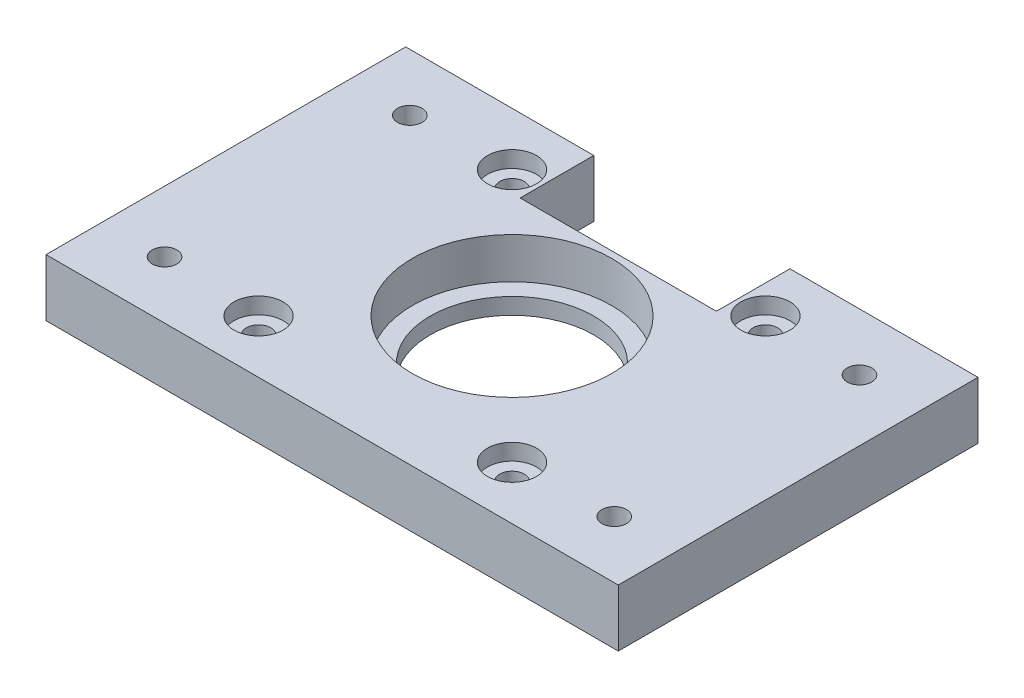
ISO-10303-21;
HEADER;
FILE_DESCRIPTION(('STEP AP214'),'2;1');
FILE_NAME('part.step','',(''),(''),'','','');
FILE_SCHEMA(('AUTOMOTIVE_DESIGN { 1 0 10303 214 1 1 1 1 }'));
ENDSEC;
DATA;
#1=APPLICATION_CONTEXT('core data for automotive mechanical design processes');
#2=APPLICATION_PROTOCOL_DEFINITION('international standard','automotive_design',2000,#1);
#3=PRODUCT_CONTEXT('',#1,'mechanical');
#4=PRODUCT('Part','Part','',(#3));
#5=PRODUCT_RELATED_PRODUCT_CATEGORY('part','',(#4));
#6=PRODUCT_DEFINITION_FORMATION('','',#4);
#7=PRODUCT_DEFINITION_CONTEXT('part definition',#1,'design');
#8=PRODUCT_DEFINITION('design','',#6,#7);
#9=PRODUCT_DEFINITION_SHAPE('','',#8);
#10=(LENGTH_UNIT() NAMED_UNIT(*) SI_UNIT(.MILLI.,.METRE.));
#11=(NAMED_UNIT(*) PLANE_ANGLE_UNIT() SI_UNIT($,.RADIAN.));
#12=(NAMED_UNIT(*) SI_UNIT($,.STERADIAN.) SOLID_ANGLE_UNIT());
#13=UNCERTAINTY_MEASURE_WITH_UNIT(LENGTH_MEASURE(1.E-05),#10,'distance_accuracy_value','');
#14=(GEOMETRIC_REPRESENTATION_CONTEXT(3) GLOBAL_UNCERTAINTY_ASSIGNED_CONTEXT((#13)) GLOBAL_UNIT_ASSIGNED_CONTEXT((#10,
#11,#12)) REPRESENTATION_CONTEXT('',''));
#15=CARTESIAN_POINT('',(0.,0.,0.));
#16=DIRECTION('',(0.,0.,1.));
#17=DIRECTION('',(1.,0.,0.));
#18=AXIS2_PLACEMENT_3D('',#15,#16,#17);
#19=CARTESIAN_POINT('',(15.5,7.,15.5));
#20=DIRECTION('',(0.,-1.,0.));
#21=DIRECTION('',(0.,0.,-1.));
#22=AXIS2_PLACEMENT_3D('',#19,#20,#21);
#23=CYLINDRICAL_SURFACE('',#22,1.5);
#24=CARTESIAN_POINT('',(15.5,0.,15.5));
#25=DIRECTION('',(0.,1.,0.));
#26=DIRECTION('',(0.,0.,1.));
#27=AXIS2_PLACEMENT_3D('',#24,#25,#26);
#28=CIRCLE('',#27,1.5);
#29=CARTESIAN_POINT('',(15.5,0.,17.));
#30=VERTEX_POINT('',#29);
#31=EDGE_CURVE('E231',#30,#30,#28,.T.);
#32=ORIENTED_EDGE('',*,*,#31,.F.);
#33=EDGE_LOOP('',(#32));
#34=FACE_BOUND('',#33,.T.);
#35=CARTESIAN_POINT('',(15.5,5.,15.5));
#36=DIRECTION('',(0.,1.,0.));
#37=DIRECTION('',(0.,0.,1.));
#38=AXIS2_PLACEMENT_3D('',#35,#36,#37);
#39=CIRCLE('',#38,1.5);
#40=CARTESIAN_POINT('',(15.5,5.,17.));
#41=VERTEX_POINT('',#40);
#42=EDGE_CURVE('E37',#41,#41,#39,.T.);
#43=ORIENTED_EDGE('',*,*,#42,.T.);
#44=EDGE_LOOP('',(#43));
#45=FACE_BOUND('',#44,.T.);
#46=ADVANCED_FACE('F33',(#34,#45),#23,.F.);
#47=CARTESIAN_POINT('',(-15.5,7.,15.5));
#48=DIRECTION('',(0.,-1.,0.));
#49=DIRECTION('',(0.,0.,-1.));
#50=AXIS2_PLACEMENT_3D('',#47,#48,#49);
#51=CYLINDRICAL_SURFACE('',#50,1.5);
#52=CARTESIAN_POINT('',(-15.5,0.,15.5));
#53=DIRECTION('',(0.,1.,0.));
#54=DIRECTION('',(0.,0.,1.));
#55=AXIS2_PLACEMENT_3D('',#52,#53,#54);
#56=CIRCLE('',#55,1.5);
#57=CARTESIAN_POINT('',(-15.5,0.,17.));
#58=VERTEX_POINT('',#57);
#59=EDGE_CURVE('E228',#58,#58,#56,.T.);
#60=ORIENTED_EDGE('',*,*,#59,.F.);
#61=EDGE_LOOP('',(#60));
#62=FACE_BOUND('',#61,.T.);
#63=CARTESIAN_POINT('',(-15.5,5.,15.5));
#64=DIRECTION('',(0.,1.,0.));
#65=DIRECTION('',(0.,0.,1.));
#66=AXIS2_PLACEMENT_3D('',#63,#64,#65);
#67=CIRCLE('',#66,1.5);
#68=CARTESIAN_POINT('',(-15.5,5.,17.));
#69=VERTEX_POINT('',#68);
#70=EDGE_CURVE('E180',#69,#69,#67,.T.);
#71=ORIENTED_EDGE('',*,*,#70,.T.);
#72=EDGE_LOOP('',(#71));
#73=FACE_BOUND('',#72,.T.);
#74=ADVANCED_FACE('F285',(#62,#73),#51,.F.);
#75=CARTESIAN_POINT('',(15.5,7.,-15.5));
#76=DIRECTION('',(0.,-1.,0.));
#77=DIRECTION('',(0.,0.,-1.));
#78=AXIS2_PLACEMENT_3D('',#75,#76,#77);
#79=CYLINDRICAL_SURFACE('',#78,1.5);
#80=CARTESIAN_POINT('',(15.5,0.,-15.5));
#81=DIRECTION('',(0.,1.,0.));
#82=DIRECTION('',(0.,0.,1.));
#83=AXIS2_PLACEMENT_3D('',#80,#81,#82);
#84=CIRCLE('',#83,1.5);
#85=CARTESIAN_POINT('',(15.5,0.,-14.));
#86=VERTEX_POINT('',#85);
#87=EDGE_CURVE('E225',#86,#86,#84,.T.);
#88=ORIENTED_EDGE('',*,*,#87,.F.);
#89=EDGE_LOOP('',(#88));
#90=FACE_BOUND('',#89,.T.);
#91=CARTESIAN_POINT('',(15.5,5.,-15.5));
#92=DIRECTION('',(0.,1.,0.));
#93=DIRECTION('',(0.,0.,1.));
#94=AXIS2_PLACEMENT_3D('',#91,#92,#93);
#95=CIRCLE('',#94,1.5);
#96=CARTESIAN_POINT('',(15.5,5.,-14.));
#97=VERTEX_POINT('',#96);
#98=EDGE_CURVE('E177',#97,#97,#95,.T.);
#99=ORIENTED_EDGE('',*,*,#98,.T.);
#100=EDGE_LOOP('',(#99));
#101=FACE_BOUND('',#100,.T.);
#102=ADVANCED_FACE('F291',(#90,#101),#79,.F.);
#103=CARTESIAN_POINT('',(-15.5,7.,-15.5));
#104=DIRECTION('',(0.,-1.,0.));
#105=DIRECTION('',(0.,0.,-1.));
#106=AXIS2_PLACEMENT_3D('',#103,#104,#105);
#107=CYLINDRICAL_SURFACE('',#106,1.5);
#108=CARTESIAN_POINT('',(-15.5,0.,-15.5));
#109=DIRECTION('',(0.,1.,0.));
#110=DIRECTION('',(0.,0.,1.));
#111=AXIS2_PLACEMENT_3D('',#108,#109,#110);
#112=CIRCLE('',#111,1.5);
#113=CARTESIAN_POINT('',(-15.5,0.,-14.));
#114=VERTEX_POINT('',#113);
#115=EDGE_CURVE('E222',#114,#114,#112,.T.);
#116=ORIENTED_EDGE('',*,*,#115,.F.);
#117=EDGE_LOOP('',(#116));
#118=FACE_BOUND('',#117,.T.);
#119=CARTESIAN_POINT('',(-15.5,5.,-15.5));
#120=DIRECTION('',(0.,1.,0.));
#121=DIRECTION('',(0.,0.,1.));
#122=AXIS2_PLACEMENT_3D('',#119,#120,#121);
#123=CIRCLE('',#122,1.5);
#124=CARTESIAN_POINT('',(-15.5,5.,-14.));
#125=VERTEX_POINT('',#124);
#126=EDGE_CURVE('E174',#125,#125,#123,.T.);
#127=ORIENTED_EDGE('',*,*,#126,.T.);
#128=EDGE_LOOP('',(#127));
#129=FACE_BOUND('',#128,.T.);
#130=ADVANCED_FACE('F313',(#118,#129),#107,.F.);
#131=CARTESIAN_POINT('',(27.5,7.,15.));
#132=DIRECTION('',(0.,-1.,0.));
#133=DIRECTION('',(0.,0.,-1.));
#134=AXIS2_PLACEMENT_3D('',#131,#132,#133);
#135=CYLINDRICAL_SURFACE('',#134,1.5);
#136=CARTESIAN_POINT('',(27.5,7.,15.));
#137=DIRECTION('',(0.,1.,0.));
#138=DIRECTION('',(0.,0.,1.));
#139=AXIS2_PLACEMENT_3D('',#136,#137,#138);
#140=CIRCLE('',#139,1.5);
#141=CARTESIAN_POINT('',(27.5,7.,16.5));
#142=VERTEX_POINT('',#141);
#143=EDGE_CURVE('E243',#142,#142,#140,.T.);
#144=ORIENTED_EDGE('',*,*,#143,.T.);
#145=EDGE_LOOP('',(#144));
#146=FACE_BOUND('',#145,.T.);
#147=CARTESIAN_POINT('',(27.5,2.,15.));
#148=DIRECTION('',(0.,-1.,0.));
#149=DIRECTION('',(0.,0.,-1.));
#150=AXIS2_PLACEMENT_3D('',#147,#148,#149);
#151=CIRCLE('',#150,1.5);
#152=CARTESIAN_POINT('',(27.5,2.,13.5));
#153=VERTEX_POINT('',#152);
#154=EDGE_CURVE('E170',#153,#153,#151,.T.);
#155=ORIENTED_EDGE('',*,*,#154,.T.);
#156=EDGE_LOOP('',(#155));
#157=FACE_BOUND('',#156,.T.);
#158=ADVANCED_FACE('F309',(#146,#157),#135,.F.);
#159=CARTESIAN_POINT('',(27.5,7.,-15.));
#160=DIRECTION('',(0.,-1.,0.));
#161=DIRECTION('',(0.,0.,-1.));
#162=AXIS2_PLACEMENT_3D('',#159,#160,#161);
#163=CYLINDRICAL_SURFACE('',#162,1.5);
#164=CARTESIAN_POINT('',(27.5,7.,-15.));
#165=DIRECTION('',(0.,1.,0.));
#166=DIRECTION('',(0.,0.,1.));
#167=AXIS2_PLACEMENT_3D('',#164,#165,#166);
#168=CIRCLE('',#167,1.5);
#169=CARTESIAN_POINT('',(27.5,7.,-13.5));
#170=VERTEX_POINT('',#169);
#171=EDGE_CURVE('E240',#170,#170,#168,.T.);
#172=ORIENTED_EDGE('',*,*,#171,.T.);
#173=EDGE_LOOP('',(#172));
#174=FACE_BOUND('',#173,.T.);
#175=CARTESIAN_POINT('',(27.5,2.,-15.));
#176=DIRECTION('',(0.,-1.,0.));
#177=DIRECTION('',(0.,0.,-1.));
#178=AXIS2_PLACEMENT_3D('',#175,#176,#177);
#179=CIRCLE('',#178,1.5);
#180=CARTESIAN_POINT('',(27.5,2.,-16.5));
#181=VERTEX_POINT('',#180);
#182=EDGE_CURVE('E167',#181,#181,#179,.T.);
#183=ORIENTED_EDGE('',*,*,#182,.T.);
#184=EDGE_LOOP('',(#183));
#185=FACE_BOUND('',#184,.T.);
#186=ADVANCED_FACE('F305',(#174,#185),#163,.F.);
#187=CARTESIAN_POINT('',(-27.5,7.,15.));
#188=DIRECTION('',(0.,-1.,0.));
#189=DIRECTION('',(0.,0.,-1.));
#190=AXIS2_PLACEMENT_3D('',#187,#188,#189);
#191=CYLINDRICAL_SURFACE('',#190,1.5);
#192=CARTESIAN_POINT('',(-27.5,7.,15.));
#193=DIRECTION('',(0.,1.,0.));
#194=DIRECTION('',(0.,0.,1.));
#195=AXIS2_PLACEMENT_3D('',#192,#193,#194);
#196=CIRCLE('',#195,1.5);
#197=CARTESIAN_POINT('',(-27.5,7.,16.5));
#198=VERTEX_POINT('',#197);
#199=EDGE_CURVE('E237',#198,#198,#196,.T.);
#200=ORIENTED_EDGE('',*,*,#199,.T.);
#201=EDGE_LOOP('',(#200));
#202=FACE_BOUND('',#201,.T.);
#203=CARTESIAN_POINT('',(-27.5,2.,15.));
#204=DIRECTION('',(0.,-1.,0.));
#205=DIRECTION('',(0.,0.,-1.));
#206=AXIS2_PLACEMENT_3D('',#203,#204,#205);
#207=CIRCLE('',#206,1.5);
#208=CARTESIAN_POINT('',(-27.5,2.,13.5));
#209=VERTEX_POINT('',#208);
#210=EDGE_CURVE('E163',#209,#209,#207,.T.);
#211=ORIENTED_EDGE('',*,*,#210,.T.);
#212=EDGE_LOOP('',(#211));
#213=FACE_BOUND('',#212,.T.);
#214=ADVANCED_FACE('F301',(#202,#213),#191,.F.);
#215=CARTESIAN_POINT('',(-27.5,7.,-15.));
#216=DIRECTION('',(0.,-1.,0.));
#217=DIRECTION('',(0.,0.,-1.));
#218=AXIS2_PLACEMENT_3D('',#215,#216,#217);
#219=CYLINDRICAL_SURFACE('',#218,1.5);
#220=CARTESIAN_POINT('',(-27.5,7.,-15.));
#221=DIRECTION('',(0.,1.,0.));
#222=DIRECTION('',(0.,0.,1.));
#223=AXIS2_PLACEMENT_3D('',#220,#221,#222);
#224=CIRCLE('',#223,1.5);
#225=CARTESIAN_POINT('',(-27.5,7.,-13.5));
#226=VERTEX_POINT('',#225);
#227=EDGE_CURVE('E234',#226,#226,#224,.T.);
#228=ORIENTED_EDGE('',*,*,#227,.T.);
#229=EDGE_LOOP('',(#228));
#230=FACE_BOUND('',#229,.T.);
#231=CARTESIAN_POINT('',(-27.5,2.,-15.));
#232=DIRECTION('',(0.,-1.,0.));
#233=DIRECTION('',(0.,0.,-1.));
#234=AXIS2_PLACEMENT_3D('',#231,#232,#233);
#235=CIRCLE('',#234,1.5);
#236=CARTESIAN_POINT('',(-27.5,2.,-16.5));
#237=VERTEX_POINT('',#236);
#238=EDGE_CURVE('E160',#237,#237,#235,.T.);
#239=ORIENTED_EDGE('',*,*,#238,.T.);
#240=EDGE_LOOP('',(#239));
#241=FACE_BOUND('',#240,.T.);
#242=ADVANCED_FACE('F297',(#230,#241),#219,.F.);
#243=CARTESIAN_POINT('',(0.,7.,0.));
#244=DIRECTION('',(0.,-1.,0.));
#245=DIRECTION('',(0.,0.,-1.));
#246=AXIS2_PLACEMENT_3D('',#243,#244,#245);
#247=CYLINDRICAL_SURFACE('',#246,12.2);
#248=CARTESIAN_POINT('',(0.,7.,0.));
#249=DIRECTION('',(0.,1.,0.));
#250=DIRECTION('',(0.,0.,1.));
#251=AXIS2_PLACEMENT_3D('',#248,#249,#250);
#252=CIRCLE('',#251,12.2);
#253=CARTESIAN_POINT('',(0.,7.,12.2));
#254=VERTEX_POINT('',#253);
#255=EDGE_CURVE('E137',#254,#254,#252,.T.);
#256=ORIENTED_EDGE('',*,*,#255,.T.);
#257=EDGE_LOOP('',(#256));
#258=FACE_BOUND('',#257,.T.);
#259=CARTESIAN_POINT('',(0.,2.,0.));
#260=DIRECTION('',(0.,-1.,0.));
#261=DIRECTION('',(0.,0.,-1.));
#262=AXIS2_PLACEMENT_3D('',#259,#260,#261);
#263=CIRCLE('',#262,12.2);
#264=CARTESIAN_POINT('',(0.,2.,-12.2));
#265=VERTEX_POINT('',#264);
#266=EDGE_CURVE('E217',#265,#265,#263,.T.);
#267=ORIENTED_EDGE('',*,*,#266,.T.);
#268=EDGE_LOOP('',(#267));
#269=FACE_BOUND('',#268,.T.);
#270=ADVANCED_FACE('F300',(#258,#269),#247,.F.);
#271=CARTESIAN_POINT('',(0.,7.,0.));
#272=DIRECTION('',(0.,1.,0.));
#273=DIRECTION('',(0.,0.,1.));
#274=AXIS2_PLACEMENT_3D('',#271,#272,#273);
#275=PLANE('',#274);
#276=CARTESIAN_POINT('',(-15.5,7.,15.5));
#277=DIRECTION('',(0.,1.,0.));
#278=DIRECTION('',(0.,0.,1.));
#279=AXIS2_PLACEMENT_3D('',#276,#277,#278);
#280=CIRCLE('',#279,3.);
#281=CARTESIAN_POINT('',(-15.5,7.,18.5));
#282=VERTEX_POINT('',#281);
#283=EDGE_CURVE('E375',#282,#282,#280,.T.);
#284=ORIENTED_EDGE('',*,*,#283,.F.);
#285=EDGE_LOOP('',(#284));
#286=FACE_BOUND('',#285,.T.);
#287=CARTESIAN_POINT('',(15.5,7.,-15.5));
#288=DIRECTION('',(0.,1.,0.));
#289=DIRECTION('',(0.,0.,1.));
#290=AXIS2_PLACEMENT_3D('',#287,#288,#289);
#291=CIRCLE('',#290,3.);
#292=CARTESIAN_POINT('',(15.5,7.,-12.5));
#293=VERTEX_POINT('',#292);
#294=EDGE_CURVE('E376',#293,#293,#291,.T.);
#295=ORIENTED_EDGE('',*,*,#294,.F.);
#296=EDGE_LOOP('',(#295));
#297=FACE_BOUND('',#296,.T.);
#298=CARTESIAN_POINT('',(-15.5,7.,-15.5));
#299=DIRECTION('',(0.,1.,0.));
#300=DIRECTION('',(0.,0.,1.));
#301=AXIS2_PLACEMENT_3D('',#298,#299,#300);
#302=CIRCLE('',#301,3.);
#303=CARTESIAN_POINT('',(-15.5,7.,-12.5));
#304=VERTEX_POINT('',#303);
#305=EDGE_CURVE('E395',#304,#304,#302,.T.);
#306=ORIENTED_EDGE('',*,*,#305,.F.);
#307=EDGE_LOOP('',(#306));
#308=FACE_BOUND('',#307,.T.);
#309=CARTESIAN_POINT('',(15.5,7.,15.5));
#310=DIRECTION('',(0.,1.,0.));
#311=DIRECTION('',(0.,0.,1.));
#312=AXIS2_PLACEMENT_3D('',#309,#310,#311);
#313=CIRCLE('',#312,3.);
#314=CARTESIAN_POINT('',(15.5,7.,18.5));
#315=VERTEX_POINT('',#314);
#316=EDGE_CURVE('E387',#315,#315,#313,.T.);
#317=ORIENTED_EDGE('',*,*,#316,.F.);
#318=EDGE_LOOP('',(#317));
#319=FACE_BOUND('',#318,.T.);
#320=ORIENTED_EDGE('',*,*,#199,.F.);
#321=EDGE_LOOP('',(#320));
#322=FACE_BOUND('',#321,.T.);
#323=ORIENTED_EDGE('',*,*,#143,.F.);
#324=EDGE_LOOP('',(#323));
#325=FACE_BOUND('',#324,.T.);
#326=DIRECTION('',(0.,0.,1.));
#327=VECTOR('',#326,1.);
#328=CARTESIAN_POINT('',(-35.,7.,-22.));
#329=LINE('',#328,#327);
#330=CARTESIAN_POINT('',(-35.,7.,-22.));
#331=VERTEX_POINT('',#330);
#332=CARTESIAN_POINT('',(-35.,7.,22.));
#333=VERTEX_POINT('',#332);
#334=EDGE_CURVE('E148',#331,#333,#329,.T.);
#335=ORIENTED_EDGE('',*,*,#334,.T.);
#336=DIRECTION('',(1.,0.,0.));
#337=VECTOR('',#336,1.);
#338=CARTESIAN_POINT('',(-35.,7.,22.));
#339=LINE('',#338,#337);
#340=CARTESIAN_POINT('',(35.,7.,22.));
#341=VERTEX_POINT('',#340);
#342=EDGE_CURVE('E95',#333,#341,#339,.T.);
#343=ORIENTED_EDGE('',*,*,#342,.T.);
#344=DIRECTION('',(0.,0.,-1.));
#345=VECTOR('',#344,1.);
#346=CARTESIAN_POINT('',(35.,7.,-22.));
#347=LINE('',#346,#345);
#348=CARTESIAN_POINT('',(35.,7.,-22.));
#349=VERTEX_POINT('',#348);
#350=EDGE_CURVE('E250',#341,#349,#347,.T.);
#351=ORIENTED_EDGE('',*,*,#350,.T.);
#352=DIRECTION('',(-1.,0.,0.));
#353=VECTOR('',#352,1.);
#354=CARTESIAN_POINT('',(12.,7.,-22.));
#355=LINE('',#354,#353);
#356=CARTESIAN_POINT('',(12.,7.,-22.));
#357=VERTEX_POINT('',#356);
#358=EDGE_CURVE('E252',#349,#357,#355,.T.);
#359=ORIENTED_EDGE('',*,*,#358,.T.);
#360=DIRECTION('',(0.,0.,1.));
#361=VECTOR('',#360,1.);
#362=CARTESIAN_POINT('',(12.,7.,-22.));
#363=LINE('',#362,#361);
#364=CARTESIAN_POINT('',(12.,7.,-13.));
#365=VERTEX_POINT('',#364);
#366=EDGE_CURVE('E115',#357,#365,#363,.T.);
#367=ORIENTED_EDGE('',*,*,#366,.T.);
#368=DIRECTION('',(-1.,0.,0.));
#369=VECTOR('',#368,1.);
#370=CARTESIAN_POINT('',(-12.,7.,-13.));
#371=LINE('',#370,#369);
#372=CARTESIAN_POINT('',(-12.,7.,-13.));
#373=VERTEX_POINT('',#372);
#374=EDGE_CURVE('E108',#365,#373,#371,.T.);
#375=ORIENTED_EDGE('',*,*,#374,.T.);
#376=DIRECTION('',(0.,0.,-1.));
#377=VECTOR('',#376,1.);
#378=CARTESIAN_POINT('',(-12.,7.,-22.));
#379=LINE('',#378,#377);
#380=CARTESIAN_POINT('',(-12.,7.,-22.));
#381=VERTEX_POINT('',#380);
#382=EDGE_CURVE('E113',#373,#381,#379,.T.);
#383=ORIENTED_EDGE('',*,*,#382,.T.);
#384=DIRECTION('',(-1.,0.,0.));
#385=VECTOR('',#384,1.);
#386=CARTESIAN_POINT('',(-35.,7.,-22.));
#387=LINE('',#386,#385);
#388=EDGE_CURVE('E52',#381,#331,#387,.T.);
#389=ORIENTED_EDGE('',*,*,#388,.T.);
#390=EDGE_LOOP('',(#335,#343,#351,#359,#367,#375,#383,#389));
#391=FACE_BOUND('',#390,.T.);
#392=ORIENTED_EDGE('',*,*,#255,.F.);
#393=EDGE_LOOP('',(#392));
#394=FACE_BOUND('',#393,.T.);
#395=ORIENTED_EDGE('',*,*,#171,.F.);
#396=EDGE_LOOP('',(#395));
#397=FACE_BOUND('',#396,.T.);
#398=ORIENTED_EDGE('',*,*,#227,.F.);
#399=EDGE_LOOP('',(#398));
#400=FACE_BOUND('',#399,.T.);
#401=ADVANCED_FACE('F110',(#286,#297,#308,#319,#322,#325,#391,#394,#397,#400),#275,.T.);
#402=CARTESIAN_POINT('',(0.,0.,0.));
#403=DIRECTION('',(0.,1.,0.));
#404=DIRECTION('',(0.,0.,1.));
#405=AXIS2_PLACEMENT_3D('',#402,#403,#404);
#406=PLANE('',#405);
#407=CARTESIAN_POINT('',(-27.5,0.,-15.));
#408=DIRECTION('',(0.,-1.,0.));
#409=DIRECTION('',(0.,0.,-1.));
#410=AXIS2_PLACEMENT_3D('',#407,#408,#409);
#411=CIRCLE('',#410,3.);
#412=CARTESIAN_POINT('',(-27.5,0.,-18.));
#413=VERTEX_POINT('',#412);
#414=EDGE_CURVE('E202',#413,#413,#411,.T.);
#415=ORIENTED_EDGE('',*,*,#414,.F.);
#416=EDGE_LOOP('',(#415));
#417=FACE_BOUND('',#416,.T.);
#418=CARTESIAN_POINT('',(27.5,0.,15.));
#419=DIRECTION('',(0.,-1.,0.));
#420=DIRECTION('',(0.,0.,-1.));
#421=AXIS2_PLACEMENT_3D('',#418,#419,#420);
#422=CIRCLE('',#421,3.);
#423=CARTESIAN_POINT('',(27.5,0.,12.));
#424=VERTEX_POINT('',#423);
#425=EDGE_CURVE('E194',#424,#424,#422,.T.);
#426=ORIENTED_EDGE('',*,*,#425,.F.);
#427=EDGE_LOOP('',(#426));
#428=FACE_BOUND('',#427,.T.);
#429=CARTESIAN_POINT('',(27.5,0.,-15.));
#430=DIRECTION('',(0.,-1.,0.));
#431=DIRECTION('',(0.,0.,-1.));
#432=AXIS2_PLACEMENT_3D('',#429,#430,#431);
#433=CIRCLE('',#432,3.);
#434=CARTESIAN_POINT('',(27.5,0.,-18.));
#435=VERTEX_POINT('',#434);
#436=EDGE_CURVE('E185',#435,#435,#433,.T.);
#437=ORIENTED_EDGE('',*,*,#436,.F.);
#438=EDGE_LOOP('',(#437));
#439=FACE_BOUND('',#438,.T.);
#440=CARTESIAN_POINT('',(-27.5,0.,15.));
#441=DIRECTION('',(0.,-1.,0.));
#442=DIRECTION('',(0.,0.,-1.));
#443=AXIS2_PLACEMENT_3D('',#440,#441,#442);
#444=CIRCLE('',#443,3.);
#445=CARTESIAN_POINT('',(-27.5,0.,12.));
#446=VERTEX_POINT('',#445);
#447=EDGE_CURVE('E201',#446,#446,#444,.T.);
#448=ORIENTED_EDGE('',*,*,#447,.F.);
#449=EDGE_LOOP('',(#448));
#450=FACE_BOUND('',#449,.T.);
#451=DIRECTION('',(0.,0.,1.));
#452=VECTOR('',#451,1.);
#453=CARTESIAN_POINT('',(-35.,0.,-22.));
#454=LINE('',#453,#452);
#455=CARTESIAN_POINT('',(-35.,0.,-22.));
#456=VERTEX_POINT('',#455);
#457=CARTESIAN_POINT('',(-35.,0.,22.));
#458=VERTEX_POINT('',#457);
#459=EDGE_CURVE('E133',#456,#458,#454,.T.);
#460=ORIENTED_EDGE('',*,*,#459,.F.);
#461=DIRECTION('',(-1.,0.,0.));
#462=VECTOR('',#461,1.);
#463=CARTESIAN_POINT('',(-35.,0.,-22.));
#464=LINE('',#463,#462);
#465=CARTESIAN_POINT('',(-12.,0.,-22.));
#466=VERTEX_POINT('',#465);
#467=EDGE_CURVE('E87',#466,#456,#464,.T.);
#468=ORIENTED_EDGE('',*,*,#467,.F.);
#469=DIRECTION('',(0.,0.,-1.));
#470=VECTOR('',#469,1.);
#471=CARTESIAN_POINT('',(-12.,0.,-22.));
#472=LINE('',#471,#470);
#473=CARTESIAN_POINT('',(-12.,0.,-13.));
#474=VERTEX_POINT('',#473);
#475=EDGE_CURVE('E81',#474,#466,#472,.T.);
#476=ORIENTED_EDGE('',*,*,#475,.F.);
#477=DIRECTION('',(-1.,0.,0.));
#478=VECTOR('',#477,1.);
#479=CARTESIAN_POINT('',(-12.,0.,-13.));
#480=LINE('',#479,#478);
#481=CARTESIAN_POINT('',(12.,0.,-13.));
#482=VERTEX_POINT('',#481);
#483=EDGE_CURVE('E123',#482,#474,#480,.T.);
#484=ORIENTED_EDGE('',*,*,#483,.F.);
#485=DIRECTION('',(0.,0.,1.));
#486=VECTOR('',#485,1.);
#487=CARTESIAN_POINT('',(12.,0.,-22.));
#488=LINE('',#487,#486);
#489=CARTESIAN_POINT('',(12.,0.,-22.));
#490=VERTEX_POINT('',#489);
#491=EDGE_CURVE('E143',#490,#482,#488,.T.);
#492=ORIENTED_EDGE('',*,*,#491,.F.);
#493=DIRECTION('',(-1.,0.,0.));
#494=VECTOR('',#493,1.);
#495=CARTESIAN_POINT('',(12.,0.,-22.));
#496=LINE('',#495,#494);
#497=CARTESIAN_POINT('',(35.,0.,-22.));
#498=VERTEX_POINT('',#497);
#499=EDGE_CURVE('E141',#498,#490,#496,.T.);
#500=ORIENTED_EDGE('',*,*,#499,.F.);
#501=DIRECTION('',(0.,0.,-1.));
#502=VECTOR('',#501,1.);
#503=CARTESIAN_POINT('',(35.,0.,-22.));
#504=LINE('',#503,#502);
#505=CARTESIAN_POINT('',(35.,0.,22.));
#506=VERTEX_POINT('',#505);
#507=EDGE_CURVE('E139',#506,#498,#504,.T.);
#508=ORIENTED_EDGE('',*,*,#507,.F.);
#509=DIRECTION('',(1.,0.,0.));
#510=VECTOR('',#509,1.);
#511=CARTESIAN_POINT('',(-35.,0.,22.));
#512=LINE('',#511,#510);
#513=EDGE_CURVE('E136',#458,#506,#512,.T.);
#514=ORIENTED_EDGE('',*,*,#513,.F.);
#515=EDGE_LOOP('',(#460,#468,#476,#484,#492,#500,#508,#514));
#516=FACE_BOUND('',#515,.T.);
#517=ORIENTED_EDGE('',*,*,#31,.T.);
#518=EDGE_LOOP('',(#517));
#519=FACE_BOUND('',#518,.T.);
#520=ORIENTED_EDGE('',*,*,#59,.T.);
#521=EDGE_LOOP('',(#520));
#522=FACE_BOUND('',#521,.T.);
#523=ORIENTED_EDGE('',*,*,#87,.T.);
#524=EDGE_LOOP('',(#523));
#525=FACE_BOUND('',#524,.T.);
#526=ORIENTED_EDGE('',*,*,#115,.T.);
#527=EDGE_LOOP('',(#526));
#528=FACE_BOUND('',#527,.T.);
#529=CARTESIAN_POINT('',(0.,0.,0.));
#530=DIRECTION('',(0.,-1.,0.));
#531=DIRECTION('',(0.,0.,-1.));
#532=AXIS2_PLACEMENT_3D('',#529,#530,#531);
#533=CIRCLE('',#532,10.);
#534=CARTESIAN_POINT('',(0.,0.,-10.));
#535=VERTEX_POINT('',#534);
#536=EDGE_CURVE('E173',#535,#535,#533,.T.);
#537=ORIENTED_EDGE('',*,*,#536,.F.);
#538=EDGE_LOOP('',(#537));
#539=FACE_BOUND('',#538,.T.);
#540=ADVANCED_FACE('F265',(#417,#428,#439,#450,#516,#519,#522,#525,#528,#539),#406,.F.);
#541=CARTESIAN_POINT('',(-35.,7.,-22.));
#542=DIRECTION('',(1.,0.,0.));
#543=DIRECTION('',(0.,0.,-1.));
#544=AXIS2_PLACEMENT_3D('',#541,#542,#543);
#545=PLANE('',#544);
#546=ORIENTED_EDGE('',*,*,#459,.T.);
#547=DIRECTION('',(0.,-1.,0.));
#548=VECTOR('',#547,1.);
#549=CARTESIAN_POINT('',(-35.,7.,22.));
#550=LINE('',#549,#548);
#551=EDGE_CURVE('E11',#333,#458,#550,.T.);
#552=ORIENTED_EDGE('',*,*,#551,.F.);
#553=ORIENTED_EDGE('',*,*,#334,.F.);
#554=DIRECTION('',(0.,-1.,0.));
#555=VECTOR('',#554,1.);
#556=CARTESIAN_POINT('',(-35.,7.,-22.));
#557=LINE('',#556,#555);
#558=EDGE_CURVE('E129',#331,#456,#557,.T.);
#559=ORIENTED_EDGE('',*,*,#558,.T.);
#560=EDGE_LOOP('',(#546,#552,#553,#559));
#561=FACE_BOUND('',#560,.T.);
#562=ADVANCED_FACE('F35',(#561),#545,.F.);
#563=CARTESIAN_POINT('',(-35.,7.,22.));
#564=DIRECTION('',(0.,0.,-1.));
#565=DIRECTION('',(-1.,0.,0.));
#566=AXIS2_PLACEMENT_3D('',#563,#564,#565);
#567=PLANE('',#566);
#568=ORIENTED_EDGE('',*,*,#513,.T.);
#569=DIRECTION('',(0.,-1.,0.));
#570=VECTOR('',#569,1.);
#571=CARTESIAN_POINT('',(35.,7.,22.));
#572=LINE('',#571,#570);
#573=EDGE_CURVE('E43',#341,#506,#572,.T.);
#574=ORIENTED_EDGE('',*,*,#573,.F.);
#575=ORIENTED_EDGE('',*,*,#342,.F.);
#576=ORIENTED_EDGE('',*,*,#551,.T.);
#577=EDGE_LOOP('',(#568,#574,#575,#576));
#578=FACE_BOUND('',#577,.T.);
#579=ADVANCED_FACE('F325',(#578),#567,.F.);
#580=CARTESIAN_POINT('',(35.,7.,-22.));
#581=DIRECTION('',(-1.,0.,0.));
#582=DIRECTION('',(0.,0.,1.));
#583=AXIS2_PLACEMENT_3D('',#580,#581,#582);
#584=PLANE('',#583);
#585=ORIENTED_EDGE('',*,*,#507,.T.);
#586=DIRECTION('',(0.,-1.,0.));
#587=VECTOR('',#586,1.);
#588=CARTESIAN_POINT('',(35.,7.,-22.));
#589=LINE('',#588,#587);
#590=EDGE_CURVE('E155',#349,#498,#589,.T.);
#591=ORIENTED_EDGE('',*,*,#590,.F.);
#592=ORIENTED_EDGE('',*,*,#350,.F.);
#593=ORIENTED_EDGE('',*,*,#573,.T.);
#594=EDGE_LOOP('',(#585,#591,#592,#593));
#595=FACE_BOUND('',#594,.T.);
#596=ADVANCED_FACE('F638',(#595),#584,.F.);
#597=CARTESIAN_POINT('',(12.,7.,-22.));
#598=DIRECTION('',(0.,0.,1.));
#599=DIRECTION('',(1.,0.,0.));
#600=AXIS2_PLACEMENT_3D('',#597,#598,#599);
#601=PLANE('',#600);
#602=ORIENTED_EDGE('',*,*,#499,.T.);
#603=DIRECTION('',(0.,-1.,0.));
#604=VECTOR('',#603,1.);
#605=CARTESIAN_POINT('',(12.,7.,-22.));
#606=LINE('',#605,#604);
#607=EDGE_CURVE('E152',#357,#490,#606,.T.);
#608=ORIENTED_EDGE('',*,*,#607,.F.);
#609=ORIENTED_EDGE('',*,*,#358,.F.);
#610=ORIENTED_EDGE('',*,*,#590,.T.);
#611=EDGE_LOOP('',(#602,#608,#609,#610));
#612=FACE_BOUND('',#611,.T.);
#613=ADVANCED_FACE('F258',(#612),#601,.F.);
#614=CARTESIAN_POINT('',(12.,7.,-22.));
#615=DIRECTION('',(1.,0.,0.));
#616=DIRECTION('',(0.,0.,-1.));
#617=AXIS2_PLACEMENT_3D('',#614,#615,#616);
#618=PLANE('',#617);
#619=ORIENTED_EDGE('',*,*,#491,.T.);
#620=DIRECTION('',(0.,-1.,0.));
#621=VECTOR('',#620,1.);
#622=CARTESIAN_POINT('',(12.,7.,-13.));
#623=LINE('',#622,#621);
#624=EDGE_CURVE('E124',#365,#482,#623,.T.);
#625=ORIENTED_EDGE('',*,*,#624,.F.);
#626=ORIENTED_EDGE('',*,*,#366,.F.);
#627=ORIENTED_EDGE('',*,*,#607,.T.);
#628=EDGE_LOOP('',(#619,#625,#626,#627));
#629=FACE_BOUND('',#628,.T.);
#630=ADVANCED_FACE('F262',(#629),#618,.F.);
#631=CARTESIAN_POINT('',(-12.,7.,-13.));
#632=DIRECTION('',(0.,0.,1.));
#633=DIRECTION('',(1.,0.,0.));
#634=AXIS2_PLACEMENT_3D('',#631,#632,#633);
#635=PLANE('',#634);
#636=ORIENTED_EDGE('',*,*,#483,.T.);
#637=DIRECTION('',(0.,-1.,0.));
#638=VECTOR('',#637,1.);
#639=CARTESIAN_POINT('',(-12.,7.,-13.));
#640=LINE('',#639,#638);
#641=EDGE_CURVE('E120',#373,#474,#640,.T.);
#642=ORIENTED_EDGE('',*,*,#641,.F.);
#643=ORIENTED_EDGE('',*,*,#374,.F.);
#644=ORIENTED_EDGE('',*,*,#624,.T.);
#645=EDGE_LOOP('',(#636,#642,#643,#644));
#646=FACE_BOUND('',#645,.T.);
#647=ADVANCED_FACE('F121',(#646),#635,.F.);
#648=CARTESIAN_POINT('',(-12.,7.,-22.));
#649=DIRECTION('',(-1.,0.,0.));
#650=DIRECTION('',(0.,0.,1.));
#651=AXIS2_PLACEMENT_3D('',#648,#649,#650);
#652=PLANE('',#651);
#653=ORIENTED_EDGE('',*,*,#475,.T.);
#654=DIRECTION('',(0.,-1.,0.));
#655=VECTOR('',#654,1.);
#656=CARTESIAN_POINT('',(-12.,7.,-22.));
#657=LINE('',#656,#655);
#658=EDGE_CURVE('E125',#381,#466,#657,.T.);
#659=ORIENTED_EDGE('',*,*,#658,.F.);
#660=ORIENTED_EDGE('',*,*,#382,.F.);
#661=ORIENTED_EDGE('',*,*,#641,.T.);
#662=EDGE_LOOP('',(#653,#659,#660,#661));
#663=FACE_BOUND('',#662,.T.);
#664=ADVANCED_FACE('F127',(#663),#652,.F.);
#665=CARTESIAN_POINT('',(-35.,7.,-22.));
#666=DIRECTION('',(0.,0.,1.));
#667=DIRECTION('',(1.,0.,0.));
#668=AXIS2_PLACEMENT_3D('',#665,#666,#667);
#669=PLANE('',#668);
#670=ORIENTED_EDGE('',*,*,#467,.T.);
#671=ORIENTED_EDGE('',*,*,#558,.F.);
#672=ORIENTED_EDGE('',*,*,#388,.F.);
#673=ORIENTED_EDGE('',*,*,#658,.T.);
#674=EDGE_LOOP('',(#670,#671,#672,#673));
#675=FACE_BOUND('',#674,.T.);
#676=ADVANCED_FACE('F271',(#675),#669,.F.);
#677=CARTESIAN_POINT('',(0.,2.,0.));
#678=DIRECTION('',(0.,-1.,0.));
#679=DIRECTION('',(0.,0.,-1.));
#680=AXIS2_PLACEMENT_3D('',#677,#678,#679);
#681=PLANE('',#680);
#682=CARTESIAN_POINT('',(0.,2.,0.));
#683=DIRECTION('',(0.,-1.,0.));
#684=DIRECTION('',(0.,0.,-1.));
#685=AXIS2_PLACEMENT_3D('',#682,#683,#684);
#686=CIRCLE('',#685,10.);
#687=CARTESIAN_POINT('',(0.,2.,-10.));
#688=VERTEX_POINT('',#687);
#689=EDGE_CURVE('E214',#688,#688,#686,.T.);
#690=ORIENTED_EDGE('',*,*,#689,.T.);
#691=EDGE_LOOP('',(#690));
#692=FACE_BOUND('',#691,.T.);
#693=ORIENTED_EDGE('',*,*,#266,.F.);
#694=EDGE_LOOP('',(#693));
#695=FACE_BOUND('',#694,.T.);
#696=ADVANCED_FACE('F273',(#692,#695),#681,.F.);
#697=CARTESIAN_POINT('',(0.,2.,0.));
#698=DIRECTION('',(0.,-1.,0.));
#699=DIRECTION('',(0.,0.,-1.));
#700=AXIS2_PLACEMENT_3D('',#697,#698,#699);
#701=CYLINDRICAL_SURFACE('',#700,10.);
#702=ORIENTED_EDGE('',*,*,#689,.F.);
#703=EDGE_LOOP('',(#702));
#704=FACE_BOUND('',#703,.T.);
#705=ORIENTED_EDGE('',*,*,#536,.T.);
#706=EDGE_LOOP('',(#705));
#707=FACE_BOUND('',#706,.T.);
#708=ADVANCED_FACE('F279',(#704,#707),#701,.F.);
#709=CARTESIAN_POINT('',(-27.5,2.,-15.));
#710=DIRECTION('',(0.,-1.,0.));
#711=DIRECTION('',(0.,0.,-1.));
#712=AXIS2_PLACEMENT_3D('',#709,#710,#711);
#713=CYLINDRICAL_SURFACE('',#712,3.);
#714=CARTESIAN_POINT('',(-27.5,2.,-15.));
#715=DIRECTION('',(0.,-1.,0.));
#716=DIRECTION('',(0.,0.,-1.));
#717=AXIS2_PLACEMENT_3D('',#714,#715,#716);
#718=CIRCLE('',#717,3.);
#719=CARTESIAN_POINT('',(-27.5,2.,-18.));
#720=VERTEX_POINT('',#719);
#721=EDGE_CURVE('E198',#720,#720,#718,.T.);
#722=ORIENTED_EDGE('',*,*,#721,.F.);
#723=EDGE_LOOP('',(#722));
#724=FACE_BOUND('',#723,.T.);
#725=ORIENTED_EDGE('',*,*,#414,.T.);
#726=EDGE_LOOP('',(#725));
#727=FACE_BOUND('',#726,.T.);
#728=ADVANCED_FACE('F346',(#724,#727),#713,.F.);
#729=CARTESIAN_POINT('',(-27.5,2.,-15.));
#730=DIRECTION('',(0.,-1.,0.));
#731=DIRECTION('',(0.,0.,-1.));
#732=AXIS2_PLACEMENT_3D('',#729,#730,#731);
#733=PLANE('',#732);
#734=ORIENTED_EDGE('',*,*,#238,.F.);
#735=EDGE_LOOP('',(#734));
#736=FACE_BOUND('',#735,.T.);
#737=ORIENTED_EDGE('',*,*,#721,.T.);
#738=EDGE_LOOP('',(#737));
#739=FACE_BOUND('',#738,.T.);
#740=ADVANCED_FACE('F336',(#736,#739),#733,.T.);
#741=CARTESIAN_POINT('',(-27.5,2.,15.));
#742=DIRECTION('',(0.,-1.,0.));
#743=DIRECTION('',(0.,0.,-1.));
#744=AXIS2_PLACEMENT_3D('',#741,#742,#743);
#745=CYLINDRICAL_SURFACE('',#744,3.);
#746=CARTESIAN_POINT('',(-27.5,2.,15.));
#747=DIRECTION('',(0.,-1.,0.));
#748=DIRECTION('',(0.,0.,-1.));
#749=AXIS2_PLACEMENT_3D('',#746,#747,#748);
#750=CIRCLE('',#749,3.);
#751=CARTESIAN_POINT('',(-27.5,2.,12.));
#752=VERTEX_POINT('',#751);
#753=EDGE_CURVE('E164',#752,#752,#750,.T.);
#754=ORIENTED_EDGE('',*,*,#753,.F.);
#755=EDGE_LOOP('',(#754));
#756=FACE_BOUND('',#755,.T.);
#757=ORIENTED_EDGE('',*,*,#447,.T.);
#758=EDGE_LOOP('',(#757));
#759=FACE_BOUND('',#758,.T.);
#760=ADVANCED_FACE('F333',(#756,#759),#745,.F.);
#761=CARTESIAN_POINT('',(-27.5,2.,15.));
#762=DIRECTION('',(0.,-1.,0.));
#763=DIRECTION('',(0.,0.,-1.));
#764=AXIS2_PLACEMENT_3D('',#761,#762,#763);
#765=PLANE('',#764);
#766=ORIENTED_EDGE('',*,*,#210,.F.);
#767=EDGE_LOOP('',(#766));
#768=FACE_BOUND('',#767,.T.);
#769=ORIENTED_EDGE('',*,*,#753,.T.);
#770=EDGE_LOOP('',(#769));
#771=FACE_BOUND('',#770,.T.);
#772=ADVANCED_FACE('F335',(#768,#771),#765,.T.);
#773=CARTESIAN_POINT('',(27.5,2.,-15.));
#774=DIRECTION('',(0.,-1.,0.));
#775=DIRECTION('',(0.,0.,-1.));
#776=AXIS2_PLACEMENT_3D('',#773,#774,#775);
#777=CYLINDRICAL_SURFACE('',#776,3.);
#778=CARTESIAN_POINT('',(27.5,2.,-15.));
#779=DIRECTION('',(0.,-1.,0.));
#780=DIRECTION('',(0.,0.,-1.));
#781=AXIS2_PLACEMENT_3D('',#778,#779,#780);
#782=CIRCLE('',#781,3.);
#783=CARTESIAN_POINT('',(27.5,2.,-18.));
#784=VERTEX_POINT('',#783);
#785=EDGE_CURVE('E189',#784,#784,#782,.T.);
#786=ORIENTED_EDGE('',*,*,#785,.F.);
#787=EDGE_LOOP('',(#786));
#788=FACE_BOUND('',#787,.T.);
#789=ORIENTED_EDGE('',*,*,#436,.T.);
#790=EDGE_LOOP('',(#789));
#791=FACE_BOUND('',#790,.T.);
#792=ADVANCED_FACE('F343',(#788,#791),#777,.F.);
#793=CARTESIAN_POINT('',(27.5,2.,-15.));
#794=DIRECTION('',(0.,-1.,0.));
#795=DIRECTION('',(0.,0.,-1.));
#796=AXIS2_PLACEMENT_3D('',#793,#794,#795);
#797=PLANE('',#796);
#798=ORIENTED_EDGE('',*,*,#182,.F.);
#799=EDGE_LOOP('',(#798));
#800=FACE_BOUND('',#799,.T.);
#801=ORIENTED_EDGE('',*,*,#785,.T.);
#802=EDGE_LOOP('',(#801));
#803=FACE_BOUND('',#802,.T.);
#804=ADVANCED_FACE('F426',(#800,#803),#797,.T.);
#805=CARTESIAN_POINT('',(27.5,2.,15.));
#806=DIRECTION('',(0.,-1.,0.));
#807=DIRECTION('',(0.,0.,-1.));
#808=AXIS2_PLACEMENT_3D('',#805,#806,#807);
#809=CYLINDRICAL_SURFACE('',#808,3.);
#810=CARTESIAN_POINT('',(27.5,2.,15.));
#811=DIRECTION('',(0.,-1.,0.));
#812=DIRECTION('',(0.,0.,-1.));
#813=AXIS2_PLACEMENT_3D('',#810,#811,#812);
#814=CIRCLE('',#813,3.);
#815=CARTESIAN_POINT('',(27.5,2.,12.));
#816=VERTEX_POINT('',#815);
#817=EDGE_CURVE('E205',#816,#816,#814,.T.);
#818=ORIENTED_EDGE('',*,*,#817,.F.);
#819=EDGE_LOOP('',(#818));
#820=FACE_BOUND('',#819,.T.);
#821=ORIENTED_EDGE('',*,*,#425,.T.);
#822=EDGE_LOOP('',(#821));
#823=FACE_BOUND('',#822,.T.);
#824=ADVANCED_FACE('F420',(#820,#823),#809,.F.);
#825=CARTESIAN_POINT('',(27.5,2.,15.));
#826=DIRECTION('',(0.,-1.,0.));
#827=DIRECTION('',(0.,0.,-1.));
#828=AXIS2_PLACEMENT_3D('',#825,#826,#827);
#829=PLANE('',#828);
#830=ORIENTED_EDGE('',*,*,#154,.F.);
#831=EDGE_LOOP('',(#830));
#832=FACE_BOUND('',#831,.T.);
#833=ORIENTED_EDGE('',*,*,#817,.T.);
#834=EDGE_LOOP('',(#833));
#835=FACE_BOUND('',#834,.T.);
#836=ADVANCED_FACE('F406',(#832,#835),#829,.T.);
#837=CARTESIAN_POINT('',(-15.5,5.,-15.5));
#838=DIRECTION('',(0.,1.,0.));
#839=DIRECTION('',(0.,0.,1.));
#840=AXIS2_PLACEMENT_3D('',#837,#838,#839);
#841=CYLINDRICAL_SURFACE('',#840,3.);
#842=CARTESIAN_POINT('',(-15.5,5.,-15.5));
#843=DIRECTION('',(0.,1.,0.));
#844=DIRECTION('',(0.,0.,1.));
#845=AXIS2_PLACEMENT_3D('',#842,#843,#844);
#846=CIRCLE('',#845,3.);
#847=CARTESIAN_POINT('',(-15.5,5.,-12.5));
#848=VERTEX_POINT('',#847);
#849=EDGE_CURVE('E382',#848,#848,#846,.T.);
#850=ORIENTED_EDGE('',*,*,#849,.F.);
#851=EDGE_LOOP('',(#850));
#852=FACE_BOUND('',#851,.T.);
#853=ORIENTED_EDGE('',*,*,#305,.T.);
#854=EDGE_LOOP('',(#853));
#855=FACE_BOUND('',#854,.T.);
#856=ADVANCED_FACE('F403',(#852,#855),#841,.F.);
#857=CARTESIAN_POINT('',(-15.5,5.,-15.5));
#858=DIRECTION('',(0.,1.,0.));
#859=DIRECTION('',(0.,0.,1.));
#860=AXIS2_PLACEMENT_3D('',#857,#858,#859);
#861=PLANE('',#860);
#862=ORIENTED_EDGE('',*,*,#126,.F.);
#863=EDGE_LOOP('',(#862));
#864=FACE_BOUND('',#863,.T.);
#865=ORIENTED_EDGE('',*,*,#849,.T.);
#866=EDGE_LOOP('',(#865));
#867=FACE_BOUND('',#866,.T.);
#868=ADVANCED_FACE('F401',(#864,#867),#861,.T.);
#869=CARTESIAN_POINT('',(15.5,5.,-15.5));
#870=DIRECTION('',(0.,1.,0.));
#871=DIRECTION('',(0.,0.,1.));
#872=AXIS2_PLACEMENT_3D('',#869,#870,#871);
#873=CYLINDRICAL_SURFACE('',#872,3.);
#874=CARTESIAN_POINT('',(15.5,5.,-15.5));
#875=DIRECTION('',(0.,1.,0.));
#876=DIRECTION('',(0.,0.,1.));
#877=AXIS2_PLACEMENT_3D('',#874,#875,#876);
#878=CIRCLE('',#877,3.);
#879=CARTESIAN_POINT('',(15.5,5.,-12.5));
#880=VERTEX_POINT('',#879);
#881=EDGE_CURVE('E373',#880,#880,#878,.T.);
#882=ORIENTED_EDGE('',*,*,#881,.F.);
#883=EDGE_LOOP('',(#882));
#884=FACE_BOUND('',#883,.T.);
#885=ORIENTED_EDGE('',*,*,#294,.T.);
#886=EDGE_LOOP('',(#885));
#887=FACE_BOUND('',#886,.T.);
#888=ADVANCED_FACE('F369',(#884,#887),#873,.F.);
#889=CARTESIAN_POINT('',(15.5,5.,-15.5));
#890=DIRECTION('',(0.,1.,0.));
#891=DIRECTION('',(0.,0.,1.));
#892=AXIS2_PLACEMENT_3D('',#889,#890,#891);
#893=PLANE('',#892);
#894=ORIENTED_EDGE('',*,*,#98,.F.);
#895=EDGE_LOOP('',(#894));
#896=FACE_BOUND('',#895,.T.);
#897=ORIENTED_EDGE('',*,*,#881,.T.);
#898=EDGE_LOOP('',(#897));
#899=FACE_BOUND('',#898,.T.);
#900=ADVANCED_FACE('F365',(#896,#899),#893,.T.);
#901=CARTESIAN_POINT('',(-15.5,5.,15.5));
#902=DIRECTION('',(0.,1.,0.));
#903=DIRECTION('',(0.,0.,1.));
#904=AXIS2_PLACEMENT_3D('',#901,#902,#903);
#905=CYLINDRICAL_SURFACE('',#904,3.);
#906=CARTESIAN_POINT('',(-15.5,5.,15.5));
#907=DIRECTION('',(0.,1.,0.));
#908=DIRECTION('',(0.,0.,1.));
#909=AXIS2_PLACEMENT_3D('',#906,#907,#908);
#910=CIRCLE('',#909,3.);
#911=CARTESIAN_POINT('',(-15.5,5.,18.5));
#912=VERTEX_POINT('',#911);
#913=EDGE_CURVE('E379',#912,#912,#910,.T.);
#914=ORIENTED_EDGE('',*,*,#913,.F.);
#915=EDGE_LOOP('',(#914));
#916=FACE_BOUND('',#915,.T.);
#917=ORIENTED_EDGE('',*,*,#283,.T.);
#918=EDGE_LOOP('',(#917));
#919=FACE_BOUND('',#918,.T.);
#920=ADVANCED_FACE('F368',(#916,#919),#905,.F.);
#921=CARTESIAN_POINT('',(-15.5,5.,15.5));
#922=DIRECTION('',(0.,1.,0.));
#923=DIRECTION('',(0.,0.,1.));
#924=AXIS2_PLACEMENT_3D('',#921,#922,#923);
#925=PLANE('',#924);
#926=ORIENTED_EDGE('',*,*,#70,.F.);
#927=EDGE_LOOP('',(#926));
#928=FACE_BOUND('',#927,.T.);
#929=ORIENTED_EDGE('',*,*,#913,.T.);
#930=EDGE_LOOP('',(#929));
#931=FACE_BOUND('',#930,.T.);
#932=ADVANCED_FACE('F443',(#928,#931),#925,.T.);
#933=CARTESIAN_POINT('',(15.5,5.,15.5));
#934=DIRECTION('',(0.,1.,0.));
#935=DIRECTION('',(0.,0.,1.));
#936=AXIS2_PLACEMENT_3D('',#933,#934,#935);
#937=CYLINDRICAL_SURFACE('',#936,3.);
#938=CARTESIAN_POINT('',(15.5,5.,15.5));
#939=DIRECTION('',(0.,1.,0.));
#940=DIRECTION('',(0.,0.,1.));
#941=AXIS2_PLACEMENT_3D('',#938,#939,#940);
#942=CIRCLE('',#941,3.);
#943=CARTESIAN_POINT('',(15.5,5.,18.5));
#944=VERTEX_POINT('',#943);
#945=EDGE_CURVE('E178',#944,#944,#942,.T.);
#946=ORIENTED_EDGE('',*,*,#945,.F.);
#947=EDGE_LOOP('',(#946));
#948=FACE_BOUND('',#947,.T.);
#949=ORIENTED_EDGE('',*,*,#316,.T.);
#950=EDGE_LOOP('',(#949));
#951=FACE_BOUND('',#950,.T.);
#952=ADVANCED_FACE('F439',(#948,#951),#937,.F.);
#953=CARTESIAN_POINT('',(15.5,5.,15.5));
#954=DIRECTION('',(0.,1.,0.));
#955=DIRECTION('',(0.,0.,1.));
#956=AXIS2_PLACEMENT_3D('',#953,#954,#955);
#957=PLANE('',#956);
#958=ORIENTED_EDGE('',*,*,#42,.F.);
#959=EDGE_LOOP('',(#958));
#960=FACE_BOUND('',#959,.T.);
#961=ORIENTED_EDGE('',*,*,#945,.T.);
#962=EDGE_LOOP('',(#961));
#963=FACE_BOUND('',#962,.T.);
#964=ADVANCED_FACE('F442',(#960,#963),#957,.T.);
#965=CLOSED_SHELL('',(#46,#74,#102,#130,#158,#186,#214,#242,#270,#401,#540,#562,#579,#596,#613,
#630,#647,#664,#676,#696,#708,#728,#740,#760,#772,#792,#804,#824,#836,#856,#868,#888,#900,#920,
#932,#952,#964));
#966=MANIFOLD_SOLID_BREP('B2',#965);
#967=ADVANCED_BREP_SHAPE_REPRESENTATION('',(#18,#966),#14);
#968=SHAPE_DEFINITION_REPRESENTATION(#9,#967);
ENDSEC;
END-ISO-10303-21;
